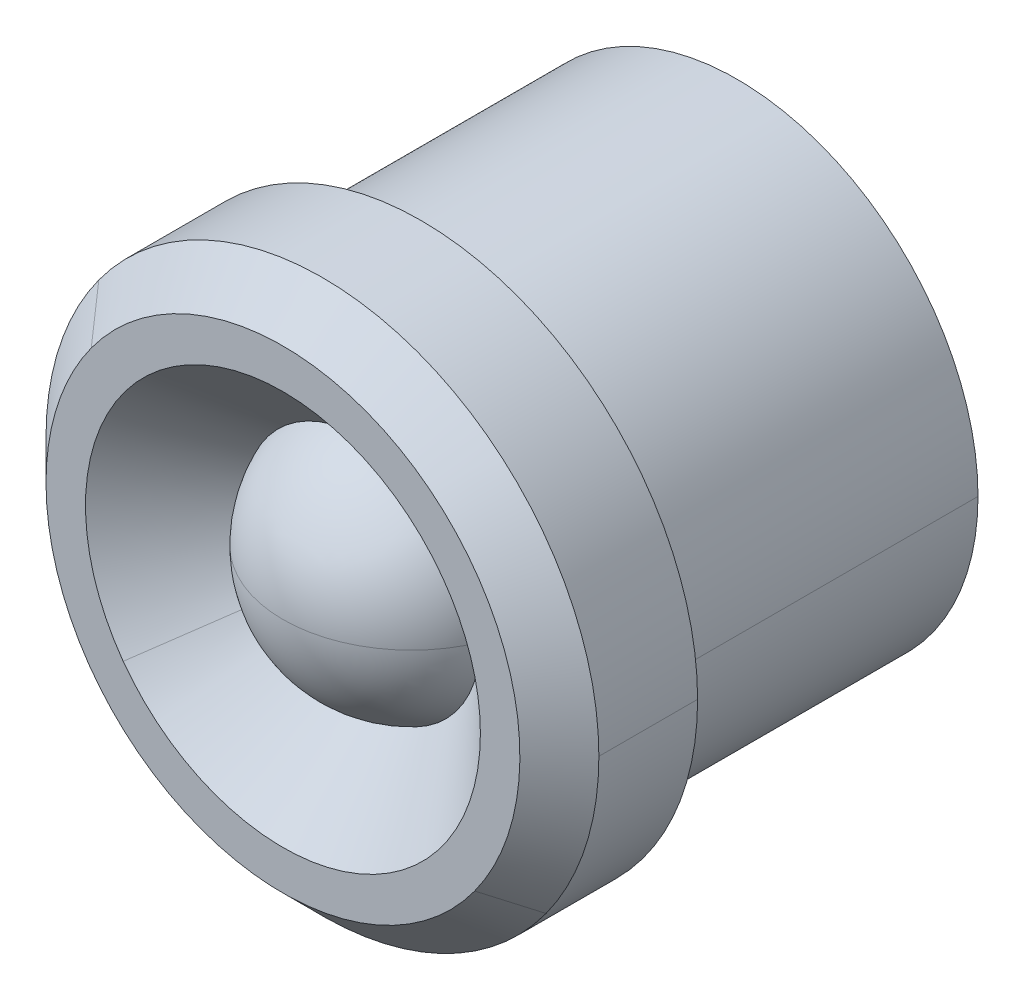
ISO-10303-21;
HEADER;
FILE_DESCRIPTION(('STEP AP214'),'2;1');
FILE_NAME('part.step','',(''),(''),'','','');
FILE_SCHEMA(('AUTOMOTIVE_DESIGN { 1 0 10303 214 1 1 1 1 }'));
ENDSEC;
DATA;
#1=APPLICATION_CONTEXT('core data for automotive mechanical design processes');
#2=APPLICATION_PROTOCOL_DEFINITION('international standard','automotive_design',2000,#1);
#3=PRODUCT_CONTEXT('',#1,'mechanical');
#4=PRODUCT('Part','Part','',(#3));
#5=PRODUCT_RELATED_PRODUCT_CATEGORY('part','',(#4));
#6=PRODUCT_DEFINITION_FORMATION('','',#4);
#7=PRODUCT_DEFINITION_CONTEXT('part definition',#1,'design');
#8=PRODUCT_DEFINITION('design','',#6,#7);
#9=PRODUCT_DEFINITION_SHAPE('','',#8);
#10=(LENGTH_UNIT() NAMED_UNIT(*) SI_UNIT(.MILLI.,.METRE.));
#11=(NAMED_UNIT(*) PLANE_ANGLE_UNIT() SI_UNIT($,.RADIAN.));
#12=(NAMED_UNIT(*) SI_UNIT($,.STERADIAN.) SOLID_ANGLE_UNIT());
#13=UNCERTAINTY_MEASURE_WITH_UNIT(LENGTH_MEASURE(1.E-05),#10,'distance_accuracy_value','');
#14=(GEOMETRIC_REPRESENTATION_CONTEXT(3) GLOBAL_UNCERTAINTY_ASSIGNED_CONTEXT((#13)) GLOBAL_UNIT_ASSIGNED_CONTEXT((#10,
#11,#12)) REPRESENTATION_CONTEXT('',''));
#15=CARTESIAN_POINT('',(0.,0.,0.));
#16=DIRECTION('',(0.,0.,1.));
#17=DIRECTION('',(1.,0.,0.));
#18=AXIS2_PLACEMENT_3D('',#15,#16,#17);
#19=CARTESIAN_POINT('',(0.,0.,0.249999999999998));
#20=DIRECTION('',(0.,0.,1.));
#21=DIRECTION('',(-1.,0.,0.));
#22=AXIS2_PLACEMENT_3D('',#19,#20,#21);
#23=SPHERICAL_SURFACE('',#22,3.25);
#24=CARTESIAN_POINT('',(0.,0.,0.250000000000081));
#25=DIRECTION('',(0.,1.,0.));
#26=DIRECTION('',(0.,0.,1.));
#27=AXIS2_PLACEMENT_3D('',#24,#25,#26);
#28=CIRCLE('',#27,3.24999999999995);
#29=CARTESIAN_POINT('',(0.,0.,3.5));
#30=VERTEX_POINT('',#29);
#31=CARTESIAN_POINT('',(3.,0.,1.5));
#32=VERTEX_POINT('',#31);
#33=EDGE_CURVE('E206',#30,#32,#28,.T.);
#34=ORIENTED_EDGE('',*,*,#33,.F.);
#35=CARTESIAN_POINT('',(0.,0.,0.249999999999998));
#36=DIRECTION('',(0.,-1.,0.));
#37=DIRECTION('',(0.,0.,1.));
#38=AXIS2_PLACEMENT_3D('',#35,#36,#37);
#39=CIRCLE('',#38,3.25);
#40=CARTESIAN_POINT('',(-3.,0.,1.5));
#41=VERTEX_POINT('',#40);
#42=EDGE_CURVE('E20',#30,#41,#39,.T.);
#43=ORIENTED_EDGE('',*,*,#42,.T.);
#44=CARTESIAN_POINT('',(0.,0.,1.5));
#45=DIRECTION('',(0.,0.,1.));
#46=DIRECTION('',(-1.,0.,0.));
#47=AXIS2_PLACEMENT_3D('',#44,#45,#46);
#48=CIRCLE('',#47,3.00000000000003);
#49=CARTESIAN_POINT('',(-2.42705098312484,-1.76335575687743,1.5));
#50=VERTEX_POINT('',#49);
#51=EDGE_CURVE('E166',#41,#50,#48,.T.);
#52=ORIENTED_EDGE('',*,*,#51,.T.);
#53=CARTESIAN_POINT('',(0.,0.,1.5));
#54=DIRECTION('',(0.,0.,1.));
#55=DIRECTION('',(-0.809016994374943,-0.587785252292479,0.));
#56=AXIS2_PLACEMENT_3D('',#53,#54,#55);
#57=CIRCLE('',#56,3.00000000000001);
#58=EDGE_CURVE('E11',#50,#32,#57,.T.);
#59=ORIENTED_EDGE('',*,*,#58,.T.);
#60=EDGE_LOOP('',(#34,#43,#52,#59));
#61=FACE_BOUND('',#60,.T.);
#62=ADVANCED_FACE('F16',(#61),#23,.T.);
#63=CARTESIAN_POINT('',(0.,0.,0.));
#64=DIRECTION('',(0.,0.,-1.));
#65=DIRECTION('',(-1.,0.,0.));
#66=AXIS2_PLACEMENT_3D('',#63,#64,#65);
#67=CYLINDRICAL_SURFACE('',#66,6.1);
#68=DIRECTION('',(0.,0.,-1.));
#69=VECTOR('',#68,1.);
#70=CARTESIAN_POINT('',(6.1,0.,-4.));
#71=LINE('',#70,#69);
#72=CARTESIAN_POINT('',(6.1,0.,0.));
#73=VERTEX_POINT('',#72);
#74=CARTESIAN_POINT('',(6.1,0.,-8.));
#75=VERTEX_POINT('',#74);
#76=EDGE_CURVE('E192',#73,#75,#71,.T.);
#77=ORIENTED_EDGE('',*,*,#76,.F.);
#78=CARTESIAN_POINT('',(0.,0.,0.));
#79=DIRECTION('',(0.,0.,-1.));
#80=DIRECTION('',(1.,0.,0.));
#81=AXIS2_PLACEMENT_3D('',#78,#79,#80);
#82=CIRCLE('',#81,6.1);
#83=CARTESIAN_POINT('',(-6.1,0.,0.));
#84=VERTEX_POINT('',#83);
#85=EDGE_CURVE('E295',#73,#84,#82,.T.);
#86=ORIENTED_EDGE('',*,*,#85,.T.);
#87=DIRECTION('',(0.,0.,-1.));
#88=VECTOR('',#87,1.);
#89=CARTESIAN_POINT('',(-6.1,0.,-3.99999999999998));
#90=LINE('',#89,#88);
#91=CARTESIAN_POINT('',(-6.1,0.,-8.));
#92=VERTEX_POINT('',#91);
#93=EDGE_CURVE('E184',#84,#92,#90,.T.);
#94=ORIENTED_EDGE('',*,*,#93,.T.);
#95=CARTESIAN_POINT('',(0.,0.,-8.00000000000004));
#96=DIRECTION('',(0.,0.,-1.));
#97=DIRECTION('',(1.,0.,0.));
#98=AXIS2_PLACEMENT_3D('',#95,#96,#97);
#99=CIRCLE('',#98,6.1);
#100=EDGE_CURVE('E283',#75,#92,#99,.T.);
#101=ORIENTED_EDGE('',*,*,#100,.F.);
#102=EDGE_LOOP('',(#77,#86,#94,#101));
#103=FACE_BOUND('',#102,.T.);
#104=ADVANCED_FACE('F440',(#103),#67,.T.);
#105=CARTESIAN_POINT('',(0.,0.,1.5));
#106=DIRECTION('',(0.,0.,1.));
#107=DIRECTION('',(0.,-1.,0.));
#108=AXIS2_PLACEMENT_3D('',#105,#106,#107);
#109=CONICAL_SURFACE('',#108,2.99999999999999,0.785398163397455);
#110=DIRECTION('',(0.572061402817686,0.415626937777459,0.707106781186543));
#111=VECTOR('',#110,1.);
#112=CARTESIAN_POINT('',(3.23606797749978,2.3511410091699,2.5));
#113=LINE('',#112,#111);
#114=CARTESIAN_POINT('',(2.42705098312483,1.76335575687741,1.5));
#115=VERTEX_POINT('',#114);
#116=CARTESIAN_POINT('',(4.04508497187474,2.93892626146238,3.5));
#117=VERTEX_POINT('',#116);
#118=EDGE_CURVE('E180',#115,#117,#113,.T.);
#119=ORIENTED_EDGE('',*,*,#118,.F.);
#120=CARTESIAN_POINT('',(1.03432887255117E-13,0.,1.5));
#121=DIRECTION('',(0.,0.,1.));
#122=DIRECTION('',(1.,0.,0.));
#123=AXIS2_PLACEMENT_3D('',#120,#121,#122);
#124=CIRCLE('',#123,2.9999999999999);
#125=EDGE_CURVE('E203',#32,#115,#124,.T.);
#126=ORIENTED_EDGE('',*,*,#125,.F.);
#127=ORIENTED_EDGE('',*,*,#58,.F.);
#128=DIRECTION('',(-0.572061402817686,-0.415626937777459,0.707106781186543));
#129=VECTOR('',#128,1.);
#130=CARTESIAN_POINT('',(-3.2360679774998,-2.35114100916992,2.5));
#131=LINE('',#130,#129);
#132=CARTESIAN_POINT('',(-4.04508497187475,-2.9389262614624,3.5));
#133=VERTEX_POINT('',#132);
#134=EDGE_CURVE('E173',#50,#133,#131,.T.);
#135=ORIENTED_EDGE('',*,*,#134,.T.);
#136=CARTESIAN_POINT('',(0.,0.,3.50000000000006));
#137=DIRECTION('',(0.,0.,-1.));
#138=DIRECTION('',(1.,0.,0.));
#139=AXIS2_PLACEMENT_3D('',#136,#137,#138);
#140=CIRCLE('',#139,4.99999999999999);
#141=CARTESIAN_POINT('',(5.,0.,3.5));
#142=VERTEX_POINT('',#141);
#143=EDGE_CURVE('E233',#142,#133,#140,.T.);
#144=ORIENTED_EDGE('',*,*,#143,.F.);
#145=CARTESIAN_POINT('',(0.,0.,3.49999999999985));
#146=DIRECTION('',(0.,0.,-1.));
#147=DIRECTION('',(0.809016994374948,0.587785252292473,0.));
#148=AXIS2_PLACEMENT_3D('',#145,#146,#147);
#149=CIRCLE('',#148,5.00000000000001);
#150=EDGE_CURVE('E42',#117,#142,#149,.T.);
#151=ORIENTED_EDGE('',*,*,#150,.F.);
#152=EDGE_LOOP('',(#119,#126,#127,#135,#144,#151));
#153=FACE_BOUND('',#152,.T.);
#154=ADVANCED_FACE('F232',(#153),#109,.F.);
#155=CARTESIAN_POINT('',(0.,0.,3.49999999999997));
#156=DIRECTION('',(0.,0.,-1.));
#157=DIRECTION('',(-1.,0.,0.));
#158=AXIS2_PLACEMENT_3D('',#155,#156,#157);
#159=CONICAL_SURFACE('',#158,6.00000000000002,0.78539816339746);
#160=DIRECTION('',(-0.572061402817697,0.415626937777458,-0.707106781186535));
#161=VECTOR('',#160,1.);
#162=CARTESIAN_POINT('',(-5.25861046343719,3.8206041399011,3.));
#163=LINE('',#162,#161);
#164=CARTESIAN_POINT('',(-4.8541019662497,3.52671151375485,3.5));
#165=VERTEX_POINT('',#164);
#166=CARTESIAN_POINT('',(-5.66311896062468,4.11449676604734,2.5));
#167=VERTEX_POINT('',#166);
#168=EDGE_CURVE('E139',#165,#167,#163,.T.);
#169=ORIENTED_EDGE('',*,*,#168,.F.);
#170=CARTESIAN_POINT('',(0.,0.,3.5));
#171=DIRECTION('',(0.,0.,1.));
#172=DIRECTION('',(0.80901699437495,-0.58778525229247,0.));
#173=AXIS2_PLACEMENT_3D('',#170,#171,#172);
#174=CIRCLE('',#173,6.00000000000003);
#175=CARTESIAN_POINT('',(4.8541019662497,-3.52671151375486,3.5));
#176=VERTEX_POINT('',#175);
#177=EDGE_CURVE('E70',#176,#165,#174,.T.);
#178=ORIENTED_EDGE('',*,*,#177,.F.);
#179=DIRECTION('',(0.57206140281769,-0.415626937777465,-0.707106781186536));
#180=VECTOR('',#179,1.);
#181=CARTESIAN_POINT('',(5.25861046343718,-3.82060413990111,3.));
#182=LINE('',#181,#180);
#183=CARTESIAN_POINT('',(5.66311896062467,-4.11449676604736,2.5));
#184=VERTEX_POINT('',#183);
#185=EDGE_CURVE('E252',#176,#184,#182,.T.);
#186=ORIENTED_EDGE('',*,*,#185,.T.);
#187=CARTESIAN_POINT('',(-2.68882138776405E-13,0.,2.50000000000006));
#188=DIRECTION('',(0.,0.,-1.));
#189=DIRECTION('',(1.,0.,0.));
#190=AXIS2_PLACEMENT_3D('',#187,#188,#189);
#191=CIRCLE('',#190,7.00000000000027);
#192=CARTESIAN_POINT('',(7.,0.,2.50000000000005));
#193=VERTEX_POINT('',#192);
#194=EDGE_CURVE('E27',#193,#184,#191,.T.);
#195=ORIENTED_EDGE('',*,*,#194,.F.);
#196=CARTESIAN_POINT('',(0.,-1.00613961606655E-13,2.50000000000007));
#197=DIRECTION('',(0.,0.,-1.));
#198=DIRECTION('',(-0.80901699437494,0.587785252292483,0.));
#199=AXIS2_PLACEMENT_3D('',#196,#197,#198);
#200=CIRCLE('',#199,7.0000000000001);
#201=EDGE_CURVE('E135',#167,#193,#200,.T.);
#202=ORIENTED_EDGE('',*,*,#201,.F.);
#203=EDGE_LOOP('',(#169,#178,#186,#195,#202));
#204=FACE_BOUND('',#203,.T.);
#205=ADVANCED_FACE('F137',(#204),#159,.T.);
#206=CARTESIAN_POINT('',(0.,0.,0.));
#207=DIRECTION('',(0.,0.,1.));
#208=DIRECTION('',(1.,0.,0.));
#209=AXIS2_PLACEMENT_3D('',#206,#207,#208);
#210=CYLINDRICAL_SURFACE('',#209,7.);
#211=DIRECTION('',(0.,0.,1.));
#212=VECTOR('',#211,1.);
#213=CARTESIAN_POINT('',(-7.,0.,1.25));
#214=LINE('',#213,#212);
#215=CARTESIAN_POINT('',(-7.,0.,0.));
#216=VERTEX_POINT('',#215);
#217=CARTESIAN_POINT('',(-7.,0.,2.5));
#218=VERTEX_POINT('',#217);
#219=EDGE_CURVE('E145',#216,#218,#214,.T.);
#220=ORIENTED_EDGE('',*,*,#219,.F.);
#221=CARTESIAN_POINT('',(0.,0.,0.));
#222=DIRECTION('',(0.,0.,1.));
#223=DIRECTION('',(-1.,0.,0.));
#224=AXIS2_PLACEMENT_3D('',#221,#222,#223);
#225=CIRCLE('',#224,7.);
#226=CARTESIAN_POINT('',(7.,0.,0.));
#227=VERTEX_POINT('',#226);
#228=EDGE_CURVE('E240',#216,#227,#225,.T.);
#229=ORIENTED_EDGE('',*,*,#228,.T.);
#230=DIRECTION('',(0.,0.,1.));
#231=VECTOR('',#230,1.);
#232=CARTESIAN_POINT('',(7.,0.,1.25000000000002));
#233=LINE('',#232,#231);
#234=EDGE_CURVE('E144',#227,#193,#233,.T.);
#235=ORIENTED_EDGE('',*,*,#234,.T.);
#236=ORIENTED_EDGE('',*,*,#194,.T.);
#237=CARTESIAN_POINT('',(0.,0.,2.49999999999996));
#238=DIRECTION('',(0.,0.,-1.));
#239=DIRECTION('',(0.80901699437494,-0.587785252292483,0.));
#240=AXIS2_PLACEMENT_3D('',#237,#238,#239);
#241=CIRCLE('',#240,7.00000000000007);
#242=EDGE_CURVE('E155',#184,#218,#241,.T.);
#243=ORIENTED_EDGE('',*,*,#242,.T.);
#244=EDGE_LOOP('',(#220,#229,#235,#236,#243));
#245=FACE_BOUND('',#244,.T.);
#246=ADVANCED_FACE('F406',(#245),#210,.T.);
#247=CARTESIAN_POINT('',(0.,0.,0.));
#248=DIRECTION('',(0.,0.,-1.));
#249=DIRECTION('',(-1.,0.,0.));
#250=AXIS2_PLACEMENT_3D('',#247,#248,#249);
#251=CYLINDRICAL_SURFACE('',#250,3.);
#252=DIRECTION('',(0.,0.,-1.));
#253=VECTOR('',#252,1.);
#254=CARTESIAN_POINT('',(-3.,0.,-4.));
#255=LINE('',#254,#253);
#256=CARTESIAN_POINT('',(-3.,0.,0.));
#257=VERTEX_POINT('',#256);
#258=CARTESIAN_POINT('',(-3.,0.,-8.));
#259=VERTEX_POINT('',#258);
#260=EDGE_CURVE('E269',#257,#259,#255,.T.);
#261=ORIENTED_EDGE('',*,*,#260,.F.);
#262=CARTESIAN_POINT('',(0.,0.,0.));
#263=DIRECTION('',(0.,0.,1.));
#264=DIRECTION('',(-1.,0.,0.));
#265=AXIS2_PLACEMENT_3D('',#262,#263,#264);
#266=CIRCLE('',#265,3.);
#267=CARTESIAN_POINT('',(3.,0.,0.));
#268=VERTEX_POINT('',#267);
#269=EDGE_CURVE('E280',#257,#268,#266,.T.);
#270=ORIENTED_EDGE('',*,*,#269,.T.);
#271=DIRECTION('',(0.,0.,-1.));
#272=VECTOR('',#271,1.);
#273=CARTESIAN_POINT('',(3.,0.,-4.));
#274=LINE('',#273,#272);
#275=CARTESIAN_POINT('',(3.,0.,-8.));
#276=VERTEX_POINT('',#275);
#277=EDGE_CURVE('E276',#268,#276,#274,.T.);
#278=ORIENTED_EDGE('',*,*,#277,.T.);
#279=CARTESIAN_POINT('',(0.,0.,-7.99999999999998));
#280=DIRECTION('',(0.,0.,-1.));
#281=DIRECTION('',(1.,0.,0.));
#282=AXIS2_PLACEMENT_3D('',#279,#280,#281);
#283=CIRCLE('',#282,3.);
#284=EDGE_CURVE('E286',#276,#259,#283,.T.);
#285=ORIENTED_EDGE('',*,*,#284,.T.);
#286=EDGE_LOOP('',(#261,#270,#278,#285));
#287=FACE_BOUND('',#286,.T.);
#288=ADVANCED_FACE('F402',(#287),#251,.F.);
#289=CARTESIAN_POINT('',(7.01,-7.01,0.));
#290=DIRECTION('',(0.,0.,-1.));
#291=DIRECTION('',(-1.,0.,0.));
#292=AXIS2_PLACEMENT_3D('',#289,#290,#291);
#293=PLANE('',#292);
#294=ORIENTED_EDGE('',*,*,#85,.F.);
#295=CARTESIAN_POINT('',(0.,0.,0.));
#296=DIRECTION('',(0.,0.,-1.));
#297=DIRECTION('',(-1.,0.,0.));
#298=AXIS2_PLACEMENT_3D('',#295,#296,#297);
#299=CIRCLE('',#298,6.1);
#300=EDGE_CURVE('E196',#84,#73,#299,.T.);
#301=ORIENTED_EDGE('',*,*,#300,.F.);
#302=EDGE_LOOP('',(#294,#301));
#303=FACE_BOUND('',#302,.T.);
#304=ORIENTED_EDGE('',*,*,#228,.F.);
#305=CARTESIAN_POINT('',(0.,0.,0.));
#306=DIRECTION('',(0.,0.,1.));
#307=DIRECTION('',(1.,0.,0.));
#308=AXIS2_PLACEMENT_3D('',#305,#306,#307);
#309=CIRCLE('',#308,7.);
#310=EDGE_CURVE('E251',#227,#216,#309,.T.);
#311=ORIENTED_EDGE('',*,*,#310,.F.);
#312=EDGE_LOOP('',(#304,#311));
#313=FACE_BOUND('',#312,.T.);
#314=ADVANCED_FACE('F246',(#303,#313),#293,.T.);
#315=CARTESIAN_POINT('',(-6.01,-7.06342302750968,3.5));
#316=DIRECTION('',(0.,0.,1.));
#317=DIRECTION('',(1.,0.,0.));
#318=AXIS2_PLACEMENT_3D('',#315,#316,#317);
#319=PLANE('',#318);
#320=ORIENTED_EDGE('',*,*,#143,.T.);
#321=CARTESIAN_POINT('',(0.,0.,3.5));
#322=DIRECTION('',(0.,0.,-1.));
#323=DIRECTION('',(-0.80901699437495,-0.587785252292469,0.));
#324=AXIS2_PLACEMENT_3D('',#321,#322,#323);
#325=CIRCLE('',#324,5.00000000000005);
#326=EDGE_CURVE('E177',#133,#117,#325,.T.);
#327=ORIENTED_EDGE('',*,*,#326,.T.);
#328=ORIENTED_EDGE('',*,*,#150,.T.);
#329=EDGE_LOOP('',(#320,#327,#328));
#330=FACE_BOUND('',#329,.T.);
#331=CARTESIAN_POINT('',(0.,0.,3.5));
#332=DIRECTION('',(0.,0.,1.));
#333=DIRECTION('',(-1.,0.,0.));
#334=AXIS2_PLACEMENT_3D('',#331,#332,#333);
#335=CIRCLE('',#334,6.00000000000001);
#336=CARTESIAN_POINT('',(-6.,0.,3.5));
#337=VERTEX_POINT('',#336);
#338=EDGE_CURVE('E248',#337,#176,#335,.T.);
#339=ORIENTED_EDGE('',*,*,#338,.T.);
#340=ORIENTED_EDGE('',*,*,#177,.T.);
#341=CARTESIAN_POINT('',(1.4658413372004E-13,0.,3.5));
#342=DIRECTION('',(0.,0.,1.));
#343=DIRECTION('',(-0.809016994374954,0.587785252292463,0.));
#344=AXIS2_PLACEMENT_3D('',#341,#342,#343);
#345=CIRCLE('',#344,6.00000000000015);
#346=EDGE_CURVE('E159',#165,#337,#345,.T.);
#347=ORIENTED_EDGE('',*,*,#346,.T.);
#348=EDGE_LOOP('',(#339,#340,#347));
#349=FACE_BOUND('',#348,.T.);
#350=ADVANCED_FACE('F242',(#330,#349),#319,.T.);
#351=CARTESIAN_POINT('',(6.11,-6.11,-8.));
#352=DIRECTION('',(0.,0.,-1.));
#353=DIRECTION('',(-1.,0.,0.));
#354=AXIS2_PLACEMENT_3D('',#351,#352,#353);
#355=PLANE('',#354);
#356=CARTESIAN_POINT('',(0.,0.,-8.00000000000002));
#357=DIRECTION('',(0.,0.,-1.));
#358=DIRECTION('',(-1.,0.,0.));
#359=AXIS2_PLACEMENT_3D('',#356,#357,#358);
#360=CIRCLE('',#359,3.);
#361=EDGE_CURVE('E272',#259,#276,#360,.T.);
#362=ORIENTED_EDGE('',*,*,#361,.F.);
#363=ORIENTED_EDGE('',*,*,#284,.F.);
#364=EDGE_LOOP('',(#362,#363));
#365=FACE_BOUND('',#364,.T.);
#366=ORIENTED_EDGE('',*,*,#100,.T.);
#367=CARTESIAN_POINT('',(0.,0.,-7.99999999999995));
#368=DIRECTION('',(0.,0.,-1.));
#369=DIRECTION('',(-1.,0.,0.));
#370=AXIS2_PLACEMENT_3D('',#367,#368,#369);
#371=CIRCLE('',#370,6.1);
#372=EDGE_CURVE('E188',#92,#75,#371,.T.);
#373=ORIENTED_EDGE('',*,*,#372,.T.);
#374=EDGE_LOOP('',(#366,#373));
#375=FACE_BOUND('',#374,.T.);
#376=ADVANCED_FACE('F245',(#365,#375),#355,.T.);
#377=CARTESIAN_POINT('',(3.01,-3.01,0.));
#378=DIRECTION('',(0.,0.,-1.));
#379=DIRECTION('',(-1.,0.,0.));
#380=AXIS2_PLACEMENT_3D('',#377,#378,#379);
#381=PLANE('',#380);
#382=ORIENTED_EDGE('',*,*,#269,.F.);
#383=CARTESIAN_POINT('',(0.,0.,0.));
#384=DIRECTION('',(0.,0.,1.));
#385=DIRECTION('',(1.,0.,0.));
#386=AXIS2_PLACEMENT_3D('',#383,#384,#385);
#387=CIRCLE('',#386,3.);
#388=EDGE_CURVE('E265',#268,#257,#387,.T.);
#389=ORIENTED_EDGE('',*,*,#388,.F.);
#390=EDGE_LOOP('',(#382,#389));
#391=FACE_BOUND('',#390,.T.);
#392=ADVANCED_FACE('F424',(#391),#381,.T.);
#393=CARTESIAN_POINT('',(0.,0.,0.));
#394=DIRECTION('',(0.,0.,-1.));
#395=DIRECTION('',(-1.,0.,0.));
#396=AXIS2_PLACEMENT_3D('',#393,#394,#395);
#397=CYLINDRICAL_SURFACE('',#396,3.);
#398=ORIENTED_EDGE('',*,*,#388,.T.);
#399=ORIENTED_EDGE('',*,*,#260,.T.);
#400=ORIENTED_EDGE('',*,*,#361,.T.);
#401=ORIENTED_EDGE('',*,*,#277,.F.);
#402=EDGE_LOOP('',(#398,#399,#400,#401));
#403=FACE_BOUND('',#402,.T.);
#404=ADVANCED_FACE('F397',(#403),#397,.F.);
#405=CARTESIAN_POINT('',(0.,0.,0.));
#406=DIRECTION('',(0.,0.,1.));
#407=DIRECTION('',(1.,0.,0.));
#408=AXIS2_PLACEMENT_3D('',#405,#406,#407);
#409=CYLINDRICAL_SURFACE('',#408,7.);
#410=ORIENTED_EDGE('',*,*,#310,.T.);
#411=ORIENTED_EDGE('',*,*,#219,.T.);
#412=CARTESIAN_POINT('',(3.20056481317721E-13,0.,2.50000000000017));
#413=DIRECTION('',(0.,0.,-1.));
#414=DIRECTION('',(-1.,0.,0.));
#415=AXIS2_PLACEMENT_3D('',#412,#413,#414);
#416=CIRCLE('',#415,7.00000000000032);
#417=EDGE_CURVE('E148',#218,#167,#416,.T.);
#418=ORIENTED_EDGE('',*,*,#417,.T.);
#419=ORIENTED_EDGE('',*,*,#201,.T.);
#420=ORIENTED_EDGE('',*,*,#234,.F.);
#421=EDGE_LOOP('',(#410,#411,#418,#419,#420));
#422=FACE_BOUND('',#421,.T.);
#423=ADVANCED_FACE('F150',(#422),#409,.T.);
#424=CARTESIAN_POINT('',(0.,0.,3.49999999999997));
#425=DIRECTION('',(0.,0.,-1.));
#426=DIRECTION('',(-1.,0.,0.));
#427=AXIS2_PLACEMENT_3D('',#424,#425,#426);
#428=CONICAL_SURFACE('',#427,6.00000000000002,0.78539816339746);
#429=ORIENTED_EDGE('',*,*,#346,.F.);
#430=ORIENTED_EDGE('',*,*,#168,.T.);
#431=ORIENTED_EDGE('',*,*,#417,.F.);
#432=ORIENTED_EDGE('',*,*,#242,.F.);
#433=ORIENTED_EDGE('',*,*,#185,.F.);
#434=ORIENTED_EDGE('',*,*,#338,.F.);
#435=EDGE_LOOP('',(#429,#430,#431,#432,#433,#434));
#436=FACE_BOUND('',#435,.T.);
#437=ADVANCED_FACE('F157',(#436),#428,.T.);
#438=CARTESIAN_POINT('',(0.,0.,1.50000000000001));
#439=DIRECTION('',(0.,0.,1.));
#440=DIRECTION('',(0.,-1.,0.));
#441=AXIS2_PLACEMENT_3D('',#438,#439,#440);
#442=CONICAL_SURFACE('',#441,3.,0.785398163397451);
#443=CARTESIAN_POINT('',(0.,0.,1.5));
#444=DIRECTION('',(0.,0.,1.));
#445=DIRECTION('',(0.809016994374956,0.587785252292461,0.));
#446=AXIS2_PLACEMENT_3D('',#443,#444,#445);
#447=CIRCLE('',#446,2.99999999999994);
#448=EDGE_CURVE('E200',#115,#41,#447,.T.);
#449=ORIENTED_EDGE('',*,*,#448,.F.);
#450=ORIENTED_EDGE('',*,*,#118,.T.);
#451=ORIENTED_EDGE('',*,*,#326,.F.);
#452=ORIENTED_EDGE('',*,*,#134,.F.);
#453=ORIENTED_EDGE('',*,*,#51,.F.);
#454=EDGE_LOOP('',(#449,#450,#451,#452,#453));
#455=FACE_BOUND('',#454,.T.);
#456=ADVANCED_FACE('F226',(#455),#442,.F.);
#457=CARTESIAN_POINT('',(0.,0.,0.));
#458=DIRECTION('',(0.,0.,-1.));
#459=DIRECTION('',(-1.,0.,0.));
#460=AXIS2_PLACEMENT_3D('',#457,#458,#459);
#461=CYLINDRICAL_SURFACE('',#460,6.1);
#462=ORIENTED_EDGE('',*,*,#300,.T.);
#463=ORIENTED_EDGE('',*,*,#76,.T.);
#464=ORIENTED_EDGE('',*,*,#372,.F.);
#465=ORIENTED_EDGE('',*,*,#93,.F.);
#466=EDGE_LOOP('',(#462,#463,#464,#465));
#467=FACE_BOUND('',#466,.T.);
#468=ADVANCED_FACE('F416',(#467),#461,.T.);
#469=CARTESIAN_POINT('',(0.,0.,0.250000000000047));
#470=DIRECTION('',(0.,0.,1.));
#471=DIRECTION('',(1.,0.,0.));
#472=AXIS2_PLACEMENT_3D('',#469,#470,#471);
#473=SPHERICAL_SURFACE('',#472,3.24999999999996);
#474=ORIENTED_EDGE('',*,*,#42,.F.);
#475=ORIENTED_EDGE('',*,*,#33,.T.);
#476=ORIENTED_EDGE('',*,*,#125,.T.);
#477=ORIENTED_EDGE('',*,*,#448,.T.);
#478=EDGE_LOOP('',(#474,#475,#476,#477));
#479=FACE_BOUND('',#478,.T.);
#480=ADVANCED_FACE('F18',(#479),#473,.T.);
#481=CLOSED_SHELL('',(#62,#104,#154,#205,#246,#288,#314,#350,#376,#392,#404,#423,#437,#456,#468,#480));
#482=MANIFOLD_SOLID_BREP('B1',#481);
#483=ADVANCED_BREP_SHAPE_REPRESENTATION('',(#18,#482),#14);
#484=SHAPE_DEFINITION_REPRESENTATION(#9,#483);
ENDSEC;
END-ISO-10303-21;
